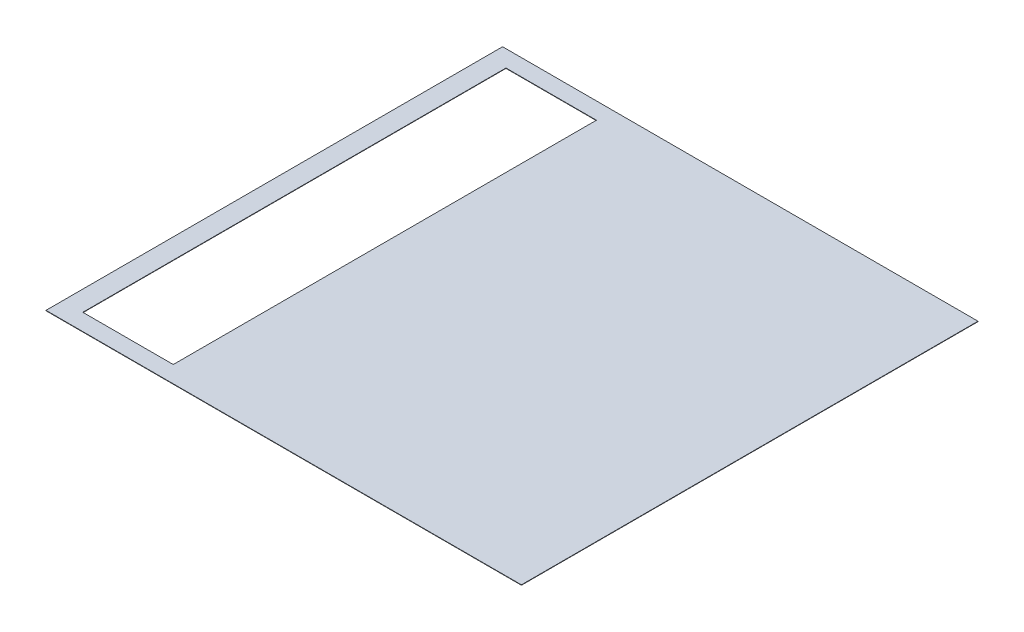
ISO-10303-21;
HEADER;
FILE_DESCRIPTION(('STEP AP214'),'2;1');
FILE_NAME('part.step','',(''),(''),'','','');
FILE_SCHEMA(('AUTOMOTIVE_DESIGN { 1 0 10303 214 1 1 1 1 }'));
ENDSEC;
DATA;
#1=APPLICATION_CONTEXT('core data for automotive mechanical design processes');
#2=APPLICATION_PROTOCOL_DEFINITION('international standard','automotive_design',2000,#1);
#3=PRODUCT_CONTEXT('',#1,'mechanical');
#4=PRODUCT('Part','Part','',(#3));
#5=PRODUCT_RELATED_PRODUCT_CATEGORY('part','',(#4));
#6=PRODUCT_DEFINITION_FORMATION('','',#4);
#7=PRODUCT_DEFINITION_CONTEXT('part definition',#1,'design');
#8=PRODUCT_DEFINITION('design','',#6,#7);
#9=PRODUCT_DEFINITION_SHAPE('','',#8);
#10=(LENGTH_UNIT() NAMED_UNIT(*) SI_UNIT(.MILLI.,.METRE.));
#11=(NAMED_UNIT(*) PLANE_ANGLE_UNIT() SI_UNIT($,.RADIAN.));
#12=(NAMED_UNIT(*) SI_UNIT($,.STERADIAN.) SOLID_ANGLE_UNIT());
#13=UNCERTAINTY_MEASURE_WITH_UNIT(LENGTH_MEASURE(1.E-05),#10,'distance_accuracy_value','');
#14=(GEOMETRIC_REPRESENTATION_CONTEXT(3) GLOBAL_UNCERTAINTY_ASSIGNED_CONTEXT((#13)) GLOBAL_UNIT_ASSIGNED_CONTEXT((#10,
#11,#12)) REPRESENTATION_CONTEXT('',''));
#15=CARTESIAN_POINT('',(0.,0.,0.));
#16=DIRECTION('',(0.,0.,1.));
#17=DIRECTION('',(1.,0.,0.));
#18=AXIS2_PLACEMENT_3D('',#15,#16,#17);
#19=CARTESIAN_POINT('',(473.,-0.8,454.25));
#20=DIRECTION('',(1.,0.,0.));
#21=DIRECTION('',(0.,0.,-1.));
#22=AXIS2_PLACEMENT_3D('',#19,#20,#21);
#23=PLANE('',#22);
#24=DIRECTION('',(0.,0.,-1.));
#25=VECTOR('',#24,1.);
#26=CARTESIAN_POINT('',(473.,0.,454.25));
#27=LINE('',#26,#25);
#28=CARTESIAN_POINT('',(473.,0.,454.25));
#29=VERTEX_POINT('',#28);
#30=CARTESIAN_POINT('',(473.,0.,-454.25));
#31=VERTEX_POINT('',#30);
#32=EDGE_CURVE('E131',#29,#31,#27,.T.);
#33=ORIENTED_EDGE('',*,*,#32,.F.);
#34=DIRECTION('',(0.,1.,0.));
#35=VECTOR('',#34,1.);
#36=CARTESIAN_POINT('',(473.,-0.8,454.25));
#37=LINE('',#36,#35);
#38=CARTESIAN_POINT('',(473.,-0.8,454.25));
#39=VERTEX_POINT('',#38);
#40=EDGE_CURVE('E11',#39,#29,#37,.T.);
#41=ORIENTED_EDGE('',*,*,#40,.F.);
#42=DIRECTION('',(0.,0.,-1.));
#43=VECTOR('',#42,1.);
#44=CARTESIAN_POINT('',(473.,-0.8,454.25));
#45=LINE('',#44,#43);
#46=CARTESIAN_POINT('',(473.,-0.8,-454.25));
#47=VERTEX_POINT('',#46);
#48=EDGE_CURVE('E135',#39,#47,#45,.T.);
#49=ORIENTED_EDGE('',*,*,#48,.T.);
#50=DIRECTION('',(0.,1.,0.));
#51=VECTOR('',#50,1.);
#52=CARTESIAN_POINT('',(473.,-0.8,-454.25));
#53=LINE('',#52,#51);
#54=EDGE_CURVE('E36',#47,#31,#53,.T.);
#55=ORIENTED_EDGE('',*,*,#54,.T.);
#56=EDGE_LOOP('',(#33,#41,#49,#55));
#57=FACE_BOUND('',#56,.T.);
#58=ADVANCED_FACE('F33',(#57),#23,.T.);
#59=CARTESIAN_POINT('',(-473.,-0.8,454.25));
#60=DIRECTION('',(0.,0.,1.));
#61=DIRECTION('',(1.,0.,0.));
#62=AXIS2_PLACEMENT_3D('',#59,#60,#61);
#63=PLANE('',#62);
#64=DIRECTION('',(1.,0.,0.));
#65=VECTOR('',#64,1.);
#66=CARTESIAN_POINT('',(-473.,0.,454.25));
#67=LINE('',#66,#65);
#68=CARTESIAN_POINT('',(-473.,0.,454.25));
#69=VERTEX_POINT('',#68);
#70=EDGE_CURVE('E139',#69,#29,#67,.T.);
#71=ORIENTED_EDGE('',*,*,#70,.F.);
#72=DIRECTION('',(0.,1.,0.));
#73=VECTOR('',#72,1.);
#74=CARTESIAN_POINT('',(-473.,-0.8,454.25));
#75=LINE('',#74,#73);
#76=CARTESIAN_POINT('',(-473.,-0.8,454.25));
#77=VERTEX_POINT('',#76);
#78=EDGE_CURVE('E41',#77,#69,#75,.T.);
#79=ORIENTED_EDGE('',*,*,#78,.F.);
#80=DIRECTION('',(1.,0.,0.));
#81=VECTOR('',#80,1.);
#82=CARTESIAN_POINT('',(-473.,-0.8,454.25));
#83=LINE('',#82,#81);
#84=EDGE_CURVE('E145',#77,#39,#83,.T.);
#85=ORIENTED_EDGE('',*,*,#84,.T.);
#86=ORIENTED_EDGE('',*,*,#40,.T.);
#87=EDGE_LOOP('',(#71,#79,#85,#86));
#88=FACE_BOUND('',#87,.T.);
#89=ADVANCED_FACE('F171',(#88),#63,.T.);
#90=CARTESIAN_POINT('',(-473.,-0.8,454.25));
#91=DIRECTION('',(-1.,0.,0.));
#92=DIRECTION('',(0.,0.,1.));
#93=AXIS2_PLACEMENT_3D('',#90,#91,#92);
#94=PLANE('',#93);
#95=DIRECTION('',(0.,0.,1.));
#96=VECTOR('',#95,1.);
#97=CARTESIAN_POINT('',(-473.,0.,454.25));
#98=LINE('',#97,#96);
#99=CARTESIAN_POINT('',(-473.,0.,-454.25));
#100=VERTEX_POINT('',#99);
#101=EDGE_CURVE('E153',#100,#69,#98,.T.);
#102=ORIENTED_EDGE('',*,*,#101,.F.);
#103=DIRECTION('',(0.,1.,0.));
#104=VECTOR('',#103,1.);
#105=CARTESIAN_POINT('',(-473.,-0.8,-454.25));
#106=LINE('',#105,#104);
#107=CARTESIAN_POINT('',(-473.,-0.8,-454.25));
#108=VERTEX_POINT('',#107);
#109=EDGE_CURVE('E158',#108,#100,#106,.T.);
#110=ORIENTED_EDGE('',*,*,#109,.F.);
#111=DIRECTION('',(0.,0.,1.));
#112=VECTOR('',#111,1.);
#113=CARTESIAN_POINT('',(-473.,-0.8,454.25));
#114=LINE('',#113,#112);
#115=EDGE_CURVE('E142',#108,#77,#114,.T.);
#116=ORIENTED_EDGE('',*,*,#115,.T.);
#117=ORIENTED_EDGE('',*,*,#78,.T.);
#118=EDGE_LOOP('',(#102,#110,#116,#117));
#119=FACE_BOUND('',#118,.T.);
#120=ADVANCED_FACE('F175',(#119),#94,.T.);
#121=CARTESIAN_POINT('',(-473.,-0.8,-454.25));
#122=DIRECTION('',(0.,0.,-1.));
#123=DIRECTION('',(-1.,0.,0.));
#124=AXIS2_PLACEMENT_3D('',#121,#122,#123);
#125=PLANE('',#124);
#126=DIRECTION('',(-1.,0.,0.));
#127=VECTOR('',#126,1.);
#128=CARTESIAN_POINT('',(-473.,0.,-454.25));
#129=LINE('',#128,#127);
#130=EDGE_CURVE('E150',#31,#100,#129,.T.);
#131=ORIENTED_EDGE('',*,*,#130,.F.);
#132=ORIENTED_EDGE('',*,*,#54,.F.);
#133=DIRECTION('',(-1.,0.,0.));
#134=VECTOR('',#133,1.);
#135=CARTESIAN_POINT('',(-473.,-0.8,-454.25));
#136=LINE('',#135,#134);
#137=EDGE_CURVE('E138',#47,#108,#136,.T.);
#138=ORIENTED_EDGE('',*,*,#137,.T.);
#139=ORIENTED_EDGE('',*,*,#109,.T.);
#140=EDGE_LOOP('',(#131,#132,#138,#139));
#141=FACE_BOUND('',#140,.T.);
#142=ADVANCED_FACE('F166',(#141),#125,.T.);
#143=CARTESIAN_POINT('',(473.,-0.8,-454.25));
#144=DIRECTION('',(0.,-1.,0.));
#145=DIRECTION('',(0.,0.,-1.));
#146=AXIS2_PLACEMENT_3D('',#143,#144,#145);
#147=PLANE('',#146);
#148=DIRECTION('',(0.,0.,1.));
#149=VECTOR('',#148,1.);
#150=CARTESIAN_POINT('',(-433.,-0.8,421.));
#151=LINE('',#150,#149);
#152=CARTESIAN_POINT('',(-433.,-0.8,-421.));
#153=VERTEX_POINT('',#152);
#154=CARTESIAN_POINT('',(-433.,-0.8,421.));
#155=VERTEX_POINT('',#154);
#156=EDGE_CURVE('E100',#153,#155,#151,.T.);
#157=ORIENTED_EDGE('',*,*,#156,.T.);
#158=DIRECTION('',(1.,0.,0.));
#159=VECTOR('',#158,1.);
#160=CARTESIAN_POINT('',(-433.,-0.8,421.));
#161=LINE('',#160,#159);
#162=CARTESIAN_POINT('',(-253.,-0.8,421.));
#163=VERTEX_POINT('',#162);
#164=EDGE_CURVE('E109',#155,#163,#161,.T.);
#165=ORIENTED_EDGE('',*,*,#164,.T.);
#166=DIRECTION('',(0.,0.,-1.));
#167=VECTOR('',#166,1.);
#168=CARTESIAN_POINT('',(-253.,-0.8,421.));
#169=LINE('',#168,#167);
#170=CARTESIAN_POINT('',(-253.,-0.8,-421.));
#171=VERTEX_POINT('',#170);
#172=EDGE_CURVE('E49',#163,#171,#169,.T.);
#173=ORIENTED_EDGE('',*,*,#172,.T.);
#174=DIRECTION('',(-1.,0.,0.));
#175=VECTOR('',#174,1.);
#176=CARTESIAN_POINT('',(-433.,-0.8,-421.));
#177=LINE('',#176,#175);
#178=EDGE_CURVE('E106',#171,#153,#177,.T.);
#179=ORIENTED_EDGE('',*,*,#178,.T.);
#180=EDGE_LOOP('',(#157,#165,#173,#179));
#181=FACE_BOUND('',#180,.T.);
#182=ORIENTED_EDGE('',*,*,#48,.F.);
#183=ORIENTED_EDGE('',*,*,#84,.F.);
#184=ORIENTED_EDGE('',*,*,#115,.F.);
#185=ORIENTED_EDGE('',*,*,#137,.F.);
#186=EDGE_LOOP('',(#182,#183,#184,#185));
#187=FACE_BOUND('',#186,.T.);
#188=ADVANCED_FACE('F113',(#181,#187),#147,.T.);
#189=CARTESIAN_POINT('',(473.,0.,-454.25));
#190=DIRECTION('',(0.,-1.,0.));
#191=DIRECTION('',(0.,0.,-1.));
#192=AXIS2_PLACEMENT_3D('',#189,#190,#191);
#193=PLANE('',#192);
#194=DIRECTION('',(1.,0.,0.));
#195=VECTOR('',#194,1.);
#196=CARTESIAN_POINT('',(-433.,0.,421.));
#197=LINE('',#196,#195);
#198=CARTESIAN_POINT('',(-433.,0.,421.));
#199=VERTEX_POINT('',#198);
#200=CARTESIAN_POINT('',(-253.,0.,421.));
#201=VERTEX_POINT('',#200);
#202=EDGE_CURVE('E125',#199,#201,#197,.T.);
#203=ORIENTED_EDGE('',*,*,#202,.F.);
#204=DIRECTION('',(0.,0.,1.));
#205=VECTOR('',#204,1.);
#206=CARTESIAN_POINT('',(-433.,0.,421.));
#207=LINE('',#206,#205);
#208=CARTESIAN_POINT('',(-433.,0.,-421.));
#209=VERTEX_POINT('',#208);
#210=EDGE_CURVE('E57',#209,#199,#207,.T.);
#211=ORIENTED_EDGE('',*,*,#210,.F.);
#212=DIRECTION('',(-1.,0.,0.));
#213=VECTOR('',#212,1.);
#214=CARTESIAN_POINT('',(-433.,0.,-421.));
#215=LINE('',#214,#213);
#216=CARTESIAN_POINT('',(-253.,0.,-421.));
#217=VERTEX_POINT('',#216);
#218=EDGE_CURVE('E116',#217,#209,#215,.T.);
#219=ORIENTED_EDGE('',*,*,#218,.F.);
#220=DIRECTION('',(0.,0.,-1.));
#221=VECTOR('',#220,1.);
#222=CARTESIAN_POINT('',(-253.,0.,421.));
#223=LINE('',#222,#221);
#224=EDGE_CURVE('E119',#201,#217,#223,.T.);
#225=ORIENTED_EDGE('',*,*,#224,.F.);
#226=EDGE_LOOP('',(#203,#211,#219,#225));
#227=FACE_BOUND('',#226,.T.);
#228=ORIENTED_EDGE('',*,*,#32,.T.);
#229=ORIENTED_EDGE('',*,*,#130,.T.);
#230=ORIENTED_EDGE('',*,*,#101,.T.);
#231=ORIENTED_EDGE('',*,*,#70,.T.);
#232=EDGE_LOOP('',(#228,#229,#230,#231));
#233=FACE_BOUND('',#232,.T.);
#234=ADVANCED_FACE('F168',(#227,#233),#193,.F.);
#235=CARTESIAN_POINT('',(-433.,-0.8,421.));
#236=DIRECTION('',(-1.,0.,0.));
#237=DIRECTION('',(0.,0.,1.));
#238=AXIS2_PLACEMENT_3D('',#235,#236,#237);
#239=PLANE('',#238);
#240=ORIENTED_EDGE('',*,*,#210,.T.);
#241=DIRECTION('',(0.,1.,0.));
#242=VECTOR('',#241,1.);
#243=CARTESIAN_POINT('',(-433.,-0.8,421.));
#244=LINE('',#243,#242);
#245=EDGE_CURVE('E96',#155,#199,#244,.T.);
#246=ORIENTED_EDGE('',*,*,#245,.F.);
#247=ORIENTED_EDGE('',*,*,#156,.F.);
#248=DIRECTION('',(0.,1.,0.));
#249=VECTOR('',#248,1.);
#250=CARTESIAN_POINT('',(-433.,-0.8,-421.));
#251=LINE('',#250,#249);
#252=EDGE_CURVE('E129',#153,#209,#251,.T.);
#253=ORIENTED_EDGE('',*,*,#252,.T.);
#254=EDGE_LOOP('',(#240,#246,#247,#253));
#255=FACE_BOUND('',#254,.T.);
#256=ADVANCED_FACE('F98',(#255),#239,.F.);
#257=CARTESIAN_POINT('',(-433.,-0.8,-421.));
#258=DIRECTION('',(0.,0.,-1.));
#259=DIRECTION('',(-1.,0.,0.));
#260=AXIS2_PLACEMENT_3D('',#257,#258,#259);
#261=PLANE('',#260);
#262=ORIENTED_EDGE('',*,*,#218,.T.);
#263=ORIENTED_EDGE('',*,*,#252,.F.);
#264=ORIENTED_EDGE('',*,*,#178,.F.);
#265=DIRECTION('',(0.,1.,0.));
#266=VECTOR('',#265,1.);
#267=CARTESIAN_POINT('',(-253.,-0.8,-421.));
#268=LINE('',#267,#266);
#269=EDGE_CURVE('E132',#171,#217,#268,.T.);
#270=ORIENTED_EDGE('',*,*,#269,.T.);
#271=EDGE_LOOP('',(#262,#263,#264,#270));
#272=FACE_BOUND('',#271,.T.);
#273=ADVANCED_FACE('F231',(#272),#261,.F.);
#274=CARTESIAN_POINT('',(-253.,-0.8,421.));
#275=DIRECTION('',(1.,0.,0.));
#276=DIRECTION('',(0.,0.,-1.));
#277=AXIS2_PLACEMENT_3D('',#274,#275,#276);
#278=PLANE('',#277);
#279=ORIENTED_EDGE('',*,*,#224,.T.);
#280=ORIENTED_EDGE('',*,*,#269,.F.);
#281=ORIENTED_EDGE('',*,*,#172,.F.);
#282=DIRECTION('',(0.,1.,0.));
#283=VECTOR('',#282,1.);
#284=CARTESIAN_POINT('',(-253.,-0.8,421.));
#285=LINE('',#284,#283);
#286=EDGE_CURVE('E105',#163,#201,#285,.T.);
#287=ORIENTED_EDGE('',*,*,#286,.T.);
#288=EDGE_LOOP('',(#279,#280,#281,#287));
#289=FACE_BOUND('',#288,.T.);
#290=ADVANCED_FACE('F241',(#289),#278,.F.);
#291=CARTESIAN_POINT('',(-433.,-0.8,421.));
#292=DIRECTION('',(0.,0.,1.));
#293=DIRECTION('',(1.,0.,0.));
#294=AXIS2_PLACEMENT_3D('',#291,#292,#293);
#295=PLANE('',#294);
#296=ORIENTED_EDGE('',*,*,#202,.T.);
#297=ORIENTED_EDGE('',*,*,#286,.F.);
#298=ORIENTED_EDGE('',*,*,#164,.F.);
#299=ORIENTED_EDGE('',*,*,#245,.T.);
#300=EDGE_LOOP('',(#296,#297,#298,#299));
#301=FACE_BOUND('',#300,.T.);
#302=ADVANCED_FACE('F110',(#301),#295,.F.);
#303=CLOSED_SHELL('',(#58,#89,#120,#142,#188,#234,#256,#273,#290,#302));
#304=MANIFOLD_SOLID_BREP('B2',#303);
#305=ADVANCED_BREP_SHAPE_REPRESENTATION('',(#18,#304),#14);
#306=SHAPE_DEFINITION_REPRESENTATION(#9,#305);
ENDSEC;
END-ISO-10303-21;
